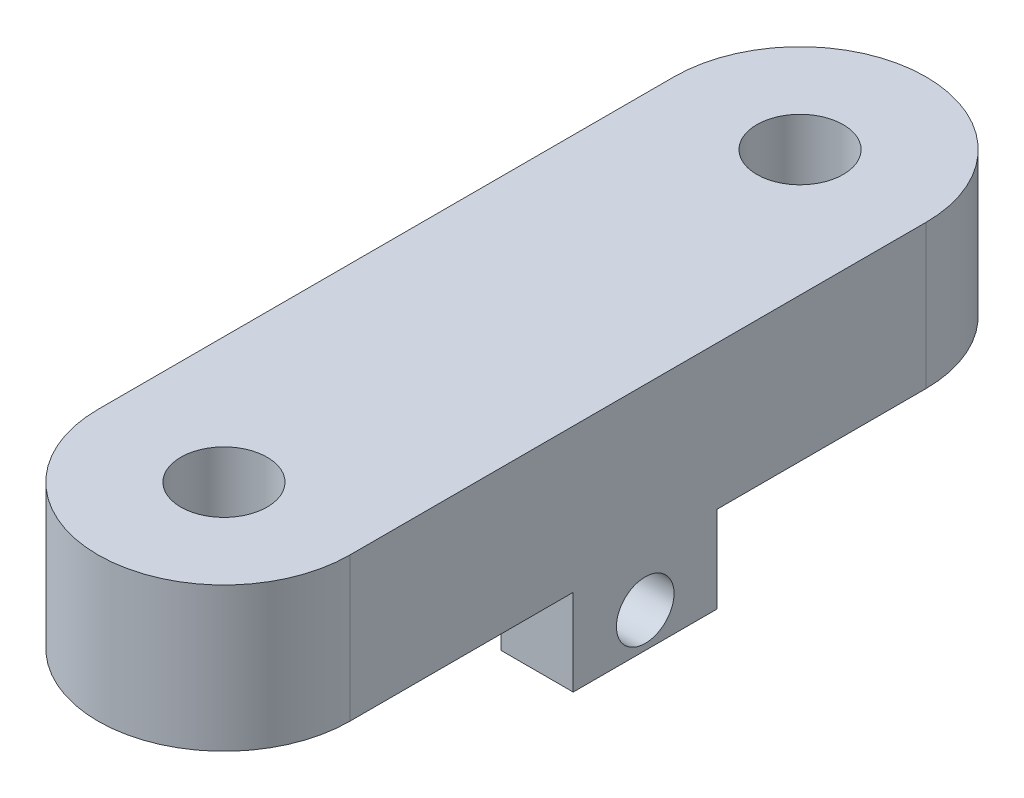
ISO-10303-21;
HEADER;
FILE_DESCRIPTION(('STEP AP214'),'2;1');
FILE_NAME('part.step','',(''),(''),'','','');
FILE_SCHEMA(('AUTOMOTIVE_DESIGN { 1 0 10303 214 1 1 1 1 }'));
ENDSEC;
DATA;
#1=APPLICATION_CONTEXT('core data for automotive mechanical design processes');
#2=APPLICATION_PROTOCOL_DEFINITION('international standard','automotive_design',2000,#1);
#3=PRODUCT_CONTEXT('',#1,'mechanical');
#4=PRODUCT('Part','Part','',(#3));
#5=PRODUCT_RELATED_PRODUCT_CATEGORY('part','',(#4));
#6=PRODUCT_DEFINITION_FORMATION('','',#4);
#7=PRODUCT_DEFINITION_CONTEXT('part definition',#1,'design');
#8=PRODUCT_DEFINITION('design','',#6,#7);
#9=PRODUCT_DEFINITION_SHAPE('','',#8);
#10=(LENGTH_UNIT() NAMED_UNIT(*) SI_UNIT(.MILLI.,.METRE.));
#11=(NAMED_UNIT(*) PLANE_ANGLE_UNIT() SI_UNIT($,.RADIAN.));
#12=(NAMED_UNIT(*) SI_UNIT($,.STERADIAN.) SOLID_ANGLE_UNIT());
#13=UNCERTAINTY_MEASURE_WITH_UNIT(LENGTH_MEASURE(1.E-05),#10,'distance_accuracy_value','');
#14=(GEOMETRIC_REPRESENTATION_CONTEXT(3) GLOBAL_UNCERTAINTY_ASSIGNED_CONTEXT((#13)) GLOBAL_UNIT_ASSIGNED_CONTEXT((#10,
#11,#12)) REPRESENTATION_CONTEXT('',''));
#15=CARTESIAN_POINT('',(0.,0.,0.));
#16=DIRECTION('',(0.,0.,1.));
#17=DIRECTION('',(1.,0.,0.));
#18=AXIS2_PLACEMENT_3D('',#15,#16,#17);
#19=CARTESIAN_POINT('',(-8.75,6.,-24.4999999999998));
#20=DIRECTION('',(0.,-1.,0.));
#21=DIRECTION('',(0.,0.,-1.));
#22=AXIS2_PLACEMENT_3D('',#19,#20,#21);
#23=PLANE('',#22);
#24=CARTESIAN_POINT('',(-8.75,6.,-24.4999999999998));
#25=DIRECTION('',(0.,1.,0.));
#26=DIRECTION('',(0.,0.,1.));
#27=AXIS2_PLACEMENT_3D('',#24,#25,#26);
#28=CIRCLE('',#27,3.);
#29=CARTESIAN_POINT('',(-8.75,6.,-21.4999999999998));
#30=VERTEX_POINT('',#29);
#31=EDGE_CURVE('E187',#30,#30,#28,.T.);
#32=ORIENTED_EDGE('',*,*,#31,.T.);
#33=EDGE_LOOP('',(#32));
#34=FACE_BOUND('',#33,.T.);
#35=CARTESIAN_POINT('',(-8.75,6.,15.5000000000002));
#36=DIRECTION('',(0.,1.,0.));
#37=DIRECTION('',(0.,0.,1.));
#38=AXIS2_PLACEMENT_3D('',#35,#36,#37);
#39=CIRCLE('',#38,3.);
#40=CARTESIAN_POINT('',(-8.75,6.,18.5000000000002));
#41=VERTEX_POINT('',#40);
#42=EDGE_CURVE('E167',#41,#41,#39,.T.);
#43=ORIENTED_EDGE('',*,*,#42,.T.);
#44=EDGE_LOOP('',(#43));
#45=FACE_BOUND('',#44,.T.);
#46=DIRECTION('',(0.,0.,1.));
#47=VECTOR('',#46,1.);
#48=CARTESIAN_POINT('',(-5.,6.,-10.));
#49=LINE('',#48,#47);
#50=CARTESIAN_POINT('',(-5.,6.,-10.));
#51=VERTEX_POINT('',#50);
#52=CARTESIAN_POINT('',(-5.,6.,0.));
#53=VERTEX_POINT('',#52);
#54=EDGE_CURVE('E153',#51,#53,#49,.T.);
#55=ORIENTED_EDGE('',*,*,#54,.T.);
#56=DIRECTION('',(1.,0.,0.));
#57=VECTOR('',#56,1.);
#58=CARTESIAN_POINT('',(-5.,6.,0.));
#59=LINE('',#58,#57);
#60=CARTESIAN_POINT('',(0.,6.,0.));
#61=VERTEX_POINT('',#60);
#62=EDGE_CURVE('E179',#53,#61,#59,.T.);
#63=ORIENTED_EDGE('',*,*,#62,.T.);
#64=DIRECTION('',(0.,0.,-1.));
#65=VECTOR('',#64,1.);
#66=CARTESIAN_POINT('',(0.,6.,15.5000000000002));
#67=LINE('',#66,#65);
#68=CARTESIAN_POINT('',(0.,6.,15.5000000000002));
#69=VERTEX_POINT('',#68);
#70=EDGE_CURVE('E202',#69,#61,#67,.T.);
#71=ORIENTED_EDGE('',*,*,#70,.F.);
#72=CARTESIAN_POINT('',(-8.75,6.,15.5000000000002));
#73=DIRECTION('',(0.,1.,0.));
#74=DIRECTION('',(0.,0.,1.));
#75=AXIS2_PLACEMENT_3D('',#72,#73,#74);
#76=CIRCLE('',#75,8.75);
#77=CARTESIAN_POINT('',(-17.5,6.,15.5000000000002));
#78=VERTEX_POINT('',#77);
#79=EDGE_CURVE('E220',#78,#69,#76,.T.);
#80=ORIENTED_EDGE('',*,*,#79,.F.);
#81=DIRECTION('',(0.,0.,1.));
#82=VECTOR('',#81,1.);
#83=CARTESIAN_POINT('',(-17.5,6.,15.5000000000002));
#84=LINE('',#83,#82);
#85=CARTESIAN_POINT('',(-17.5,6.,0.));
#86=VERTEX_POINT('',#85);
#87=EDGE_CURVE('E215',#86,#78,#84,.T.);
#88=ORIENTED_EDGE('',*,*,#87,.F.);
#89=DIRECTION('',(1.,0.,0.));
#90=VECTOR('',#89,1.);
#91=CARTESIAN_POINT('',(-17.5,6.,0.));
#92=LINE('',#91,#90);
#93=CARTESIAN_POINT('',(-12.5,6.,0.));
#94=VERTEX_POINT('',#93);
#95=EDGE_CURVE('E247',#86,#94,#92,.T.);
#96=ORIENTED_EDGE('',*,*,#95,.T.);
#97=DIRECTION('',(0.,0.,-1.));
#98=VECTOR('',#97,1.);
#99=CARTESIAN_POINT('',(-12.5,6.,0.));
#100=LINE('',#99,#98);
#101=CARTESIAN_POINT('',(-12.5,6.,-10.));
#102=VERTEX_POINT('',#101);
#103=EDGE_CURVE('E94',#94,#102,#100,.T.);
#104=ORIENTED_EDGE('',*,*,#103,.T.);
#105=DIRECTION('',(-1.,0.,0.));
#106=VECTOR('',#105,1.);
#107=CARTESIAN_POINT('',(-12.5,6.,-10.));
#108=LINE('',#107,#106);
#109=CARTESIAN_POINT('',(-17.5,6.,-10.));
#110=VERTEX_POINT('',#109);
#111=EDGE_CURVE('E253',#102,#110,#108,.T.);
#112=ORIENTED_EDGE('',*,*,#111,.T.);
#113=CARTESIAN_POINT('',(-17.5,6.,-24.4999999999998));
#114=VERTEX_POINT('',#113);
#115=EDGE_CURVE('E216',#114,#110,#84,.T.);
#116=ORIENTED_EDGE('',*,*,#115,.F.);
#117=CARTESIAN_POINT('',(-8.75,6.,-24.4999999999998));
#118=DIRECTION('',(0.,1.,0.));
#119=DIRECTION('',(0.,0.,-1.));
#120=AXIS2_PLACEMENT_3D('',#117,#118,#119);
#121=CIRCLE('',#120,8.75);
#122=CARTESIAN_POINT('',(0.,6.,-24.4999999999998));
#123=VERTEX_POINT('',#122);
#124=EDGE_CURVE('E193',#123,#114,#121,.T.);
#125=ORIENTED_EDGE('',*,*,#124,.F.);
#126=CARTESIAN_POINT('',(0.,6.,-10.));
#127=VERTEX_POINT('',#126);
#128=EDGE_CURVE('E223',#127,#123,#67,.T.);
#129=ORIENTED_EDGE('',*,*,#128,.F.);
#130=DIRECTION('',(-1.,0.,0.));
#131=VECTOR('',#130,1.);
#132=CARTESIAN_POINT('',(-5.,6.,-10.));
#133=LINE('',#132,#131);
#134=EDGE_CURVE('E62',#127,#51,#133,.T.);
#135=ORIENTED_EDGE('',*,*,#134,.T.);
#136=EDGE_LOOP('',(#55,#63,#71,#80,#88,#96,#104,#112,#116,#125,#129,#135));
#137=FACE_BOUND('',#136,.T.);
#138=ADVANCED_FACE('F45',(#34,#45,#137),#23,.T.);
#139=CARTESIAN_POINT('',(-17.5,6.,0.));
#140=DIRECTION('',(0.,0.,-1.));
#141=DIRECTION('',(-1.,0.,0.));
#142=AXIS2_PLACEMENT_3D('',#139,#140,#141);
#143=PLANE('',#142);
#144=DIRECTION('',(1.,0.,0.));
#145=VECTOR('',#144,1.);
#146=CARTESIAN_POINT('',(-17.5,0.,0.));
#147=LINE('',#146,#145);
#148=CARTESIAN_POINT('',(-17.5,0.,0.));
#149=VERTEX_POINT('',#148);
#150=CARTESIAN_POINT('',(-12.5,0.,0.));
#151=VERTEX_POINT('',#150);
#152=EDGE_CURVE('E246',#149,#151,#147,.T.);
#153=ORIENTED_EDGE('',*,*,#152,.T.);
#154=DIRECTION('',(0.,-1.,0.));
#155=VECTOR('',#154,1.);
#156=CARTESIAN_POINT('',(-12.5,6.,0.));
#157=LINE('',#156,#155);
#158=EDGE_CURVE('E11',#94,#151,#157,.T.);
#159=ORIENTED_EDGE('',*,*,#158,.F.);
#160=ORIENTED_EDGE('',*,*,#95,.F.);
#161=DIRECTION('',(0.,-1.,0.));
#162=VECTOR('',#161,1.);
#163=CARTESIAN_POINT('',(-17.5,6.,0.));
#164=LINE('',#163,#162);
#165=EDGE_CURVE('E71',#86,#149,#164,.T.);
#166=ORIENTED_EDGE('',*,*,#165,.T.);
#167=EDGE_LOOP('',(#153,#159,#160,#166));
#168=FACE_BOUND('',#167,.T.);
#169=ADVANCED_FACE('F47',(#168),#143,.F.);
#170=CARTESIAN_POINT('',(-12.5,6.,0.));
#171=DIRECTION('',(-1.,0.,0.));
#172=DIRECTION('',(0.,0.,1.));
#173=AXIS2_PLACEMENT_3D('',#170,#171,#172);
#174=PLANE('',#173);
#175=CARTESIAN_POINT('',(-12.5,2.43,-5.));
#176=DIRECTION('',(-1.,0.,0.));
#177=DIRECTION('',(0.,0.,1.));
#178=AXIS2_PLACEMENT_3D('',#175,#176,#177);
#179=CIRCLE('',#178,2.);
#180=CARTESIAN_POINT('',(-12.5,2.43,-3.));
#181=VERTEX_POINT('',#180);
#182=EDGE_CURVE('E242',#181,#181,#179,.T.);
#183=ORIENTED_EDGE('',*,*,#182,.T.);
#184=EDGE_LOOP('',(#183));
#185=FACE_BOUND('',#184,.T.);
#186=DIRECTION('',(0.,0.,-1.));
#187=VECTOR('',#186,1.);
#188=CARTESIAN_POINT('',(-12.5,0.,0.));
#189=LINE('',#188,#187);
#190=CARTESIAN_POINT('',(-12.5,0.,-10.));
#191=VERTEX_POINT('',#190);
#192=EDGE_CURVE('E260',#151,#191,#189,.T.);
#193=ORIENTED_EDGE('',*,*,#192,.T.);
#194=DIRECTION('',(0.,-1.,0.));
#195=VECTOR('',#194,1.);
#196=CARTESIAN_POINT('',(-12.5,6.,-10.));
#197=LINE('',#196,#195);
#198=EDGE_CURVE('E55',#102,#191,#197,.T.);
#199=ORIENTED_EDGE('',*,*,#198,.F.);
#200=ORIENTED_EDGE('',*,*,#103,.F.);
#201=ORIENTED_EDGE('',*,*,#158,.T.);
#202=EDGE_LOOP('',(#193,#199,#200,#201));
#203=FACE_BOUND('',#202,.T.);
#204=ADVANCED_FACE('F303',(#185,#203),#174,.F.);
#205=CARTESIAN_POINT('',(-12.5,6.,-10.));
#206=DIRECTION('',(0.,0.,1.));
#207=DIRECTION('',(1.,0.,0.));
#208=AXIS2_PLACEMENT_3D('',#205,#206,#207);
#209=PLANE('',#208);
#210=DIRECTION('',(-1.,0.,0.));
#211=VECTOR('',#210,1.);
#212=CARTESIAN_POINT('',(-12.5,0.,-10.));
#213=LINE('',#212,#211);
#214=CARTESIAN_POINT('',(-17.5,0.,-10.));
#215=VERTEX_POINT('',#214);
#216=EDGE_CURVE('E263',#191,#215,#213,.T.);
#217=ORIENTED_EDGE('',*,*,#216,.T.);
#218=DIRECTION('',(0.,-1.,0.));
#219=VECTOR('',#218,1.);
#220=CARTESIAN_POINT('',(-17.5,6.,-10.));
#221=LINE('',#220,#219);
#222=EDGE_CURVE('E270',#110,#215,#221,.T.);
#223=ORIENTED_EDGE('',*,*,#222,.F.);
#224=ORIENTED_EDGE('',*,*,#111,.F.);
#225=ORIENTED_EDGE('',*,*,#198,.T.);
#226=EDGE_LOOP('',(#217,#223,#224,#225));
#227=FACE_BOUND('',#226,.T.);
#228=ADVANCED_FACE('F278',(#227),#209,.F.);
#229=CARTESIAN_POINT('',(-17.5,6.,-10.));
#230=DIRECTION('',(1.,0.,0.));
#231=DIRECTION('',(0.,0.,-1.));
#232=AXIS2_PLACEMENT_3D('',#229,#230,#231);
#233=PLANE('',#232);
#234=CARTESIAN_POINT('',(-17.5,2.43,-5.));
#235=DIRECTION('',(1.,0.,0.));
#236=DIRECTION('',(0.,0.,-1.));
#237=AXIS2_PLACEMENT_3D('',#234,#235,#236);
#238=CIRCLE('',#237,2.);
#239=CARTESIAN_POINT('',(-17.5,2.43,-7.));
#240=VERTEX_POINT('',#239);
#241=EDGE_CURVE('E49',#240,#240,#238,.T.);
#242=ORIENTED_EDGE('',*,*,#241,.T.);
#243=EDGE_LOOP('',(#242));
#244=FACE_BOUND('',#243,.T.);
#245=DIRECTION('',(0.,0.,1.));
#246=VECTOR('',#245,1.);
#247=CARTESIAN_POINT('',(-17.5,0.,-10.));
#248=LINE('',#247,#246);
#249=EDGE_CURVE('E90',#215,#149,#248,.T.);
#250=ORIENTED_EDGE('',*,*,#249,.T.);
#251=ORIENTED_EDGE('',*,*,#165,.F.);
#252=ORIENTED_EDGE('',*,*,#87,.T.);
#253=DIRECTION('',(0.,-1.,0.));
#254=VECTOR('',#253,1.);
#255=CARTESIAN_POINT('',(-17.5,16.,15.5000000000002));
#256=LINE('',#255,#254);
#257=CARTESIAN_POINT('',(-17.5,16.,15.5000000000002));
#258=VERTEX_POINT('',#257);
#259=EDGE_CURVE('E234',#258,#78,#256,.T.);
#260=ORIENTED_EDGE('',*,*,#259,.F.);
#261=DIRECTION('',(0.,0.,1.));
#262=VECTOR('',#261,1.);
#263=CARTESIAN_POINT('',(-17.5,16.,15.5000000000002));
#264=LINE('',#263,#262);
#265=CARTESIAN_POINT('',(-17.5,16.,-24.4999999999998));
#266=VERTEX_POINT('',#265);
#267=EDGE_CURVE('E201',#266,#258,#264,.T.);
#268=ORIENTED_EDGE('',*,*,#267,.F.);
#269=DIRECTION('',(0.,-1.,0.));
#270=VECTOR('',#269,1.);
#271=CARTESIAN_POINT('',(-17.5,16.,-24.4999999999998));
#272=LINE('',#271,#270);
#273=EDGE_CURVE('E238',#266,#114,#272,.T.);
#274=ORIENTED_EDGE('',*,*,#273,.T.);
#275=ORIENTED_EDGE('',*,*,#115,.T.);
#276=ORIENTED_EDGE('',*,*,#222,.T.);
#277=EDGE_LOOP('',(#250,#251,#252,#260,#268,#274,#275,#276));
#278=FACE_BOUND('',#277,.T.);
#279=ADVANCED_FACE('F294',(#244,#278),#233,.F.);
#280=CARTESIAN_POINT('',(0.,0.,0.));
#281=DIRECTION('',(0.,1.,0.));
#282=DIRECTION('',(0.,0.,1.));
#283=AXIS2_PLACEMENT_3D('',#280,#281,#282);
#284=PLANE('',#283);
#285=ORIENTED_EDGE('',*,*,#152,.F.);
#286=ORIENTED_EDGE('',*,*,#249,.F.);
#287=ORIENTED_EDGE('',*,*,#216,.F.);
#288=ORIENTED_EDGE('',*,*,#192,.F.);
#289=EDGE_LOOP('',(#285,#286,#287,#288));
#290=FACE_BOUND('',#289,.T.);
#291=ADVANCED_FACE('F281',(#290),#284,.F.);
#292=CARTESIAN_POINT('',(-100.,2.43,-5.));
#293=DIRECTION('',(1.,0.,0.));
#294=DIRECTION('',(0.,0.,-1.));
#295=AXIS2_PLACEMENT_3D('',#292,#293,#294);
#296=CYLINDRICAL_SURFACE('',#295,2.);
#297=ORIENTED_EDGE('',*,*,#241,.F.);
#298=EDGE_LOOP('',(#297));
#299=FACE_BOUND('',#298,.T.);
#300=ORIENTED_EDGE('',*,*,#182,.F.);
#301=EDGE_LOOP('',(#300));
#302=FACE_BOUND('',#301,.T.);
#303=ADVANCED_FACE('F296',(#299,#302),#296,.F.);
#304=CARTESIAN_POINT('',(-8.75,16.,-24.4999999999998));
#305=DIRECTION('',(0.,-1.,0.));
#306=DIRECTION('',(0.,0.,-1.));
#307=AXIS2_PLACEMENT_3D('',#304,#305,#306);
#308=PLANE('',#307);
#309=CARTESIAN_POINT('',(-8.75,16.,-24.4999999999998));
#310=DIRECTION('',(0.,1.,0.));
#311=DIRECTION('',(0.,0.,-1.));
#312=AXIS2_PLACEMENT_3D('',#309,#310,#311);
#313=CIRCLE('',#312,8.75);
#314=CARTESIAN_POINT('',(0.,16.,-24.4999999999998));
#315=VERTEX_POINT('',#314);
#316=EDGE_CURVE('E197',#315,#266,#313,.T.);
#317=ORIENTED_EDGE('',*,*,#316,.T.);
#318=ORIENTED_EDGE('',*,*,#267,.T.);
#319=CARTESIAN_POINT('',(-8.75,16.,15.5000000000002));
#320=DIRECTION('',(0.,1.,0.));
#321=DIRECTION('',(0.,0.,1.));
#322=AXIS2_PLACEMENT_3D('',#319,#320,#321);
#323=CIRCLE('',#322,8.75);
#324=CARTESIAN_POINT('',(0.,16.,15.5000000000002));
#325=VERTEX_POINT('',#324);
#326=EDGE_CURVE('E205',#258,#325,#323,.T.);
#327=ORIENTED_EDGE('',*,*,#326,.T.);
#328=DIRECTION('',(0.,0.,-1.));
#329=VECTOR('',#328,1.);
#330=CARTESIAN_POINT('',(0.,16.,15.5000000000002));
#331=LINE('',#330,#329);
#332=EDGE_CURVE('E208',#325,#315,#331,.T.);
#333=ORIENTED_EDGE('',*,*,#332,.T.);
#334=EDGE_LOOP('',(#317,#318,#327,#333));
#335=FACE_BOUND('',#334,.T.);
#336=CARTESIAN_POINT('',(-8.75,16.,-24.4999999999998));
#337=DIRECTION('',(0.,1.,0.));
#338=DIRECTION('',(0.,0.,1.));
#339=AXIS2_PLACEMENT_3D('',#336,#337,#338);
#340=CIRCLE('',#339,3.);
#341=CARTESIAN_POINT('',(-8.75,16.,-21.4999999999998));
#342=VERTEX_POINT('',#341);
#343=EDGE_CURVE('E189',#342,#342,#340,.T.);
#344=ORIENTED_EDGE('',*,*,#343,.F.);
#345=EDGE_LOOP('',(#344));
#346=FACE_BOUND('',#345,.T.);
#347=CARTESIAN_POINT('',(-8.75,16.,15.5000000000002));
#348=DIRECTION('',(0.,1.,0.));
#349=DIRECTION('',(0.,0.,1.));
#350=AXIS2_PLACEMENT_3D('',#347,#348,#349);
#351=CIRCLE('',#350,3.);
#352=CARTESIAN_POINT('',(-8.75,16.,18.5000000000002));
#353=VERTEX_POINT('',#352);
#354=EDGE_CURVE('E172',#353,#353,#351,.T.);
#355=ORIENTED_EDGE('',*,*,#354,.F.);
#356=EDGE_LOOP('',(#355));
#357=FACE_BOUND('',#356,.T.);
#358=ADVANCED_FACE('F299',(#335,#346,#357),#308,.F.);
#359=CARTESIAN_POINT('',(-8.75,16.,-24.4999999999998));
#360=DIRECTION('',(0.,-1.,0.));
#361=DIRECTION('',(0.,0.,-1.));
#362=AXIS2_PLACEMENT_3D('',#359,#360,#361);
#363=CYLINDRICAL_SURFACE('',#362,8.75);
#364=ORIENTED_EDGE('',*,*,#124,.T.);
#365=ORIENTED_EDGE('',*,*,#273,.F.);
#366=ORIENTED_EDGE('',*,*,#316,.F.);
#367=DIRECTION('',(0.,-1.,0.));
#368=VECTOR('',#367,1.);
#369=CARTESIAN_POINT('',(0.,16.,-24.4999999999998));
#370=LINE('',#369,#368);
#371=EDGE_CURVE('E211',#315,#123,#370,.T.);
#372=ORIENTED_EDGE('',*,*,#371,.T.);
#373=EDGE_LOOP('',(#364,#365,#366,#372));
#374=FACE_BOUND('',#373,.T.);
#375=ADVANCED_FACE('F327',(#374),#363,.T.);
#376=CARTESIAN_POINT('',(-8.75,16.,15.5000000000002));
#377=DIRECTION('',(0.,-1.,0.));
#378=DIRECTION('',(0.,0.,-1.));
#379=AXIS2_PLACEMENT_3D('',#376,#377,#378);
#380=CYLINDRICAL_SURFACE('',#379,8.75);
#381=ORIENTED_EDGE('',*,*,#79,.T.);
#382=DIRECTION('',(0.,-1.,0.));
#383=VECTOR('',#382,1.);
#384=CARTESIAN_POINT('',(0.,16.,15.5000000000002));
#385=LINE('',#384,#383);
#386=EDGE_CURVE('E230',#325,#69,#385,.T.);
#387=ORIENTED_EDGE('',*,*,#386,.F.);
#388=ORIENTED_EDGE('',*,*,#326,.F.);
#389=ORIENTED_EDGE('',*,*,#259,.T.);
#390=EDGE_LOOP('',(#381,#387,#388,#389));
#391=FACE_BOUND('',#390,.T.);
#392=ADVANCED_FACE('F323',(#391),#380,.T.);
#393=CARTESIAN_POINT('',(0.,16.,15.5000000000002));
#394=DIRECTION('',(-1.,0.,0.));
#395=DIRECTION('',(0.,0.,1.));
#396=AXIS2_PLACEMENT_3D('',#393,#394,#395);
#397=PLANE('',#396);
#398=ORIENTED_EDGE('',*,*,#70,.T.);
#399=DIRECTION('',(0.,-1.,0.));
#400=VECTOR('',#399,1.);
#401=CARTESIAN_POINT('',(0.,6.,0.));
#402=LINE('',#401,#400);
#403=CARTESIAN_POINT('',(0.,0.,0.));
#404=VERTEX_POINT('',#403);
#405=EDGE_CURVE('E480',#61,#404,#402,.T.);
#406=ORIENTED_EDGE('',*,*,#405,.T.);
#407=DIRECTION('',(0.,0.,-1.));
#408=VECTOR('',#407,1.);
#409=CARTESIAN_POINT('',(0.,0.,-10.));
#410=LINE('',#409,#408);
#411=CARTESIAN_POINT('',(0.,0.,-10.));
#412=VERTEX_POINT('',#411);
#413=EDGE_CURVE('E152',#404,#412,#410,.T.);
#414=ORIENTED_EDGE('',*,*,#413,.T.);
#415=DIRECTION('',(0.,-1.,0.));
#416=VECTOR('',#415,1.);
#417=CARTESIAN_POINT('',(0.,6.,-10.));
#418=LINE('',#417,#416);
#419=EDGE_CURVE('E147',#127,#412,#418,.T.);
#420=ORIENTED_EDGE('',*,*,#419,.F.);
#421=ORIENTED_EDGE('',*,*,#128,.T.);
#422=ORIENTED_EDGE('',*,*,#371,.F.);
#423=ORIENTED_EDGE('',*,*,#332,.F.);
#424=ORIENTED_EDGE('',*,*,#386,.T.);
#425=EDGE_LOOP('',(#398,#406,#414,#420,#421,#422,#423,#424));
#426=FACE_BOUND('',#425,.T.);
#427=CARTESIAN_POINT('',(0.,2.43,-5.));
#428=DIRECTION('',(1.,0.,0.));
#429=DIRECTION('',(0.,0.,-1.));
#430=AXIS2_PLACEMENT_3D('',#427,#428,#429);
#431=CIRCLE('',#430,2.);
#432=CARTESIAN_POINT('',(0.,2.43,-7.));
#433=VERTEX_POINT('',#432);
#434=EDGE_CURVE('E471',#433,#433,#431,.T.);
#435=ORIENTED_EDGE('',*,*,#434,.F.);
#436=EDGE_LOOP('',(#435));
#437=FACE_BOUND('',#436,.T.);
#438=ADVANCED_FACE('F319',(#426,#437),#397,.F.);
#439=CARTESIAN_POINT('',(-8.75,16.,-24.4999999999998));
#440=DIRECTION('',(0.,-1.,0.));
#441=DIRECTION('',(0.,0.,-1.));
#442=AXIS2_PLACEMENT_3D('',#439,#440,#441);
#443=CYLINDRICAL_SURFACE('',#442,3.);
#444=ORIENTED_EDGE('',*,*,#343,.T.);
#445=EDGE_LOOP('',(#444));
#446=FACE_BOUND('',#445,.T.);
#447=ORIENTED_EDGE('',*,*,#31,.F.);
#448=EDGE_LOOP('',(#447));
#449=FACE_BOUND('',#448,.T.);
#450=ADVANCED_FACE('F322',(#446,#449),#443,.F.);
#451=CARTESIAN_POINT('',(-8.75,16.,15.5000000000002));
#452=DIRECTION('',(0.,-1.,0.));
#453=DIRECTION('',(0.,0.,-1.));
#454=AXIS2_PLACEMENT_3D('',#451,#452,#453);
#455=CYLINDRICAL_SURFACE('',#454,3.);
#456=ORIENTED_EDGE('',*,*,#354,.T.);
#457=EDGE_LOOP('',(#456));
#458=FACE_BOUND('',#457,.T.);
#459=ORIENTED_EDGE('',*,*,#42,.F.);
#460=EDGE_LOOP('',(#459));
#461=FACE_BOUND('',#460,.T.);
#462=ADVANCED_FACE('F368',(#458,#461),#455,.F.);
#463=CARTESIAN_POINT('',(-5.,6.,-10.));
#464=DIRECTION('',(1.,0.,0.));
#465=DIRECTION('',(0.,0.,-1.));
#466=AXIS2_PLACEMENT_3D('',#463,#464,#465);
#467=PLANE('',#466);
#468=CARTESIAN_POINT('',(-5.,2.43,-5.));
#469=DIRECTION('',(1.,0.,0.));
#470=DIRECTION('',(0.,0.,-1.));
#471=AXIS2_PLACEMENT_3D('',#468,#469,#470);
#472=CIRCLE('',#471,2.);
#473=CARTESIAN_POINT('',(-5.00000000000001,2.43,-7.));
#474=VERTEX_POINT('',#473);
#475=EDGE_CURVE('E474',#474,#474,#472,.T.);
#476=ORIENTED_EDGE('',*,*,#475,.T.);
#477=EDGE_LOOP('',(#476));
#478=FACE_BOUND('',#477,.T.);
#479=DIRECTION('',(0.,0.,1.));
#480=VECTOR('',#479,1.);
#481=CARTESIAN_POINT('',(-5.,0.,-10.));
#482=LINE('',#481,#480);
#483=CARTESIAN_POINT('',(-5.,0.,-10.));
#484=VERTEX_POINT('',#483);
#485=CARTESIAN_POINT('',(-5.,0.,0.));
#486=VERTEX_POINT('',#485);
#487=EDGE_CURVE('E159',#484,#486,#482,.T.);
#488=ORIENTED_EDGE('',*,*,#487,.T.);
#489=DIRECTION('',(0.,-1.,0.));
#490=VECTOR('',#489,1.);
#491=CARTESIAN_POINT('',(-5.,6.,0.));
#492=LINE('',#491,#490);
#493=EDGE_CURVE('E476',#53,#486,#492,.T.);
#494=ORIENTED_EDGE('',*,*,#493,.F.);
#495=ORIENTED_EDGE('',*,*,#54,.F.);
#496=DIRECTION('',(0.,-1.,0.));
#497=VECTOR('',#496,1.);
#498=CARTESIAN_POINT('',(-5.,6.,-10.));
#499=LINE('',#498,#497);
#500=EDGE_CURVE('E145',#51,#484,#499,.T.);
#501=ORIENTED_EDGE('',*,*,#500,.T.);
#502=EDGE_LOOP('',(#488,#494,#495,#501));
#503=FACE_BOUND('',#502,.T.);
#504=ADVANCED_FACE('F157',(#478,#503),#467,.F.);
#505=CARTESIAN_POINT('',(-5.,6.,0.));
#506=DIRECTION('',(0.,0.,-1.));
#507=DIRECTION('',(-1.,0.,0.));
#508=AXIS2_PLACEMENT_3D('',#505,#506,#507);
#509=PLANE('',#508);
#510=DIRECTION('',(1.,0.,0.));
#511=VECTOR('',#510,1.);
#512=CARTESIAN_POINT('',(-5.,0.,0.));
#513=LINE('',#512,#511);
#514=EDGE_CURVE('E164',#486,#404,#513,.T.);
#515=ORIENTED_EDGE('',*,*,#514,.T.);
#516=ORIENTED_EDGE('',*,*,#405,.F.);
#517=ORIENTED_EDGE('',*,*,#62,.F.);
#518=ORIENTED_EDGE('',*,*,#493,.T.);
#519=EDGE_LOOP('',(#515,#516,#517,#518));
#520=FACE_BOUND('',#519,.T.);
#521=ADVANCED_FACE('F384',(#520),#509,.F.);
#522=CARTESIAN_POINT('',(-5.,6.,-10.));
#523=DIRECTION('',(0.,0.,1.));
#524=DIRECTION('',(1.,0.,0.));
#525=AXIS2_PLACEMENT_3D('',#522,#523,#524);
#526=PLANE('',#525);
#527=DIRECTION('',(-1.,0.,0.));
#528=VECTOR('',#527,1.);
#529=CARTESIAN_POINT('',(-5.,0.,-10.));
#530=LINE('',#529,#528);
#531=EDGE_CURVE('E142',#412,#484,#530,.T.);
#532=ORIENTED_EDGE('',*,*,#531,.T.);
#533=ORIENTED_EDGE('',*,*,#500,.F.);
#534=ORIENTED_EDGE('',*,*,#134,.F.);
#535=ORIENTED_EDGE('',*,*,#419,.T.);
#536=EDGE_LOOP('',(#532,#533,#534,#535));
#537=FACE_BOUND('',#536,.T.);
#538=ADVANCED_FACE('F144',(#537),#526,.F.);
#539=CARTESIAN_POINT('',(0.,0.,0.));
#540=DIRECTION('',(0.,1.,0.));
#541=DIRECTION('',(0.,0.,1.));
#542=AXIS2_PLACEMENT_3D('',#539,#540,#541);
#543=PLANE('',#542);
#544=ORIENTED_EDGE('',*,*,#487,.F.);
#545=ORIENTED_EDGE('',*,*,#531,.F.);
#546=ORIENTED_EDGE('',*,*,#413,.F.);
#547=ORIENTED_EDGE('',*,*,#514,.F.);
#548=EDGE_LOOP('',(#544,#545,#546,#547));
#549=FACE_BOUND('',#548,.T.);
#550=ADVANCED_FACE('F163',(#549),#543,.F.);
#551=CARTESIAN_POINT('',(-100.,2.43,-5.));
#552=DIRECTION('',(1.,0.,0.));
#553=DIRECTION('',(0.,0.,-1.));
#554=AXIS2_PLACEMENT_3D('',#551,#552,#553);
#555=CYLINDRICAL_SURFACE('',#554,2.);
#556=ORIENTED_EDGE('',*,*,#434,.T.);
#557=EDGE_LOOP('',(#556));
#558=FACE_BOUND('',#557,.T.);
#559=ORIENTED_EDGE('',*,*,#475,.F.);
#560=EDGE_LOOP('',(#559));
#561=FACE_BOUND('',#560,.T.);
#562=ADVANCED_FACE('F406',(#558,#561),#555,.F.);
#563=CLOSED_SHELL('',(#138,#169,#204,#228,#279,#291,#303,#358,#375,#392,#438,#450,#462,#504,
#521,#538,#550,#562));
#564=MANIFOLD_SOLID_BREP('B2',#563);
#565=ADVANCED_BREP_SHAPE_REPRESENTATION('',(#18,#564),#14);
#566=SHAPE_DEFINITION_REPRESENTATION(#9,#565);
ENDSEC;
END-ISO-10303-21;
